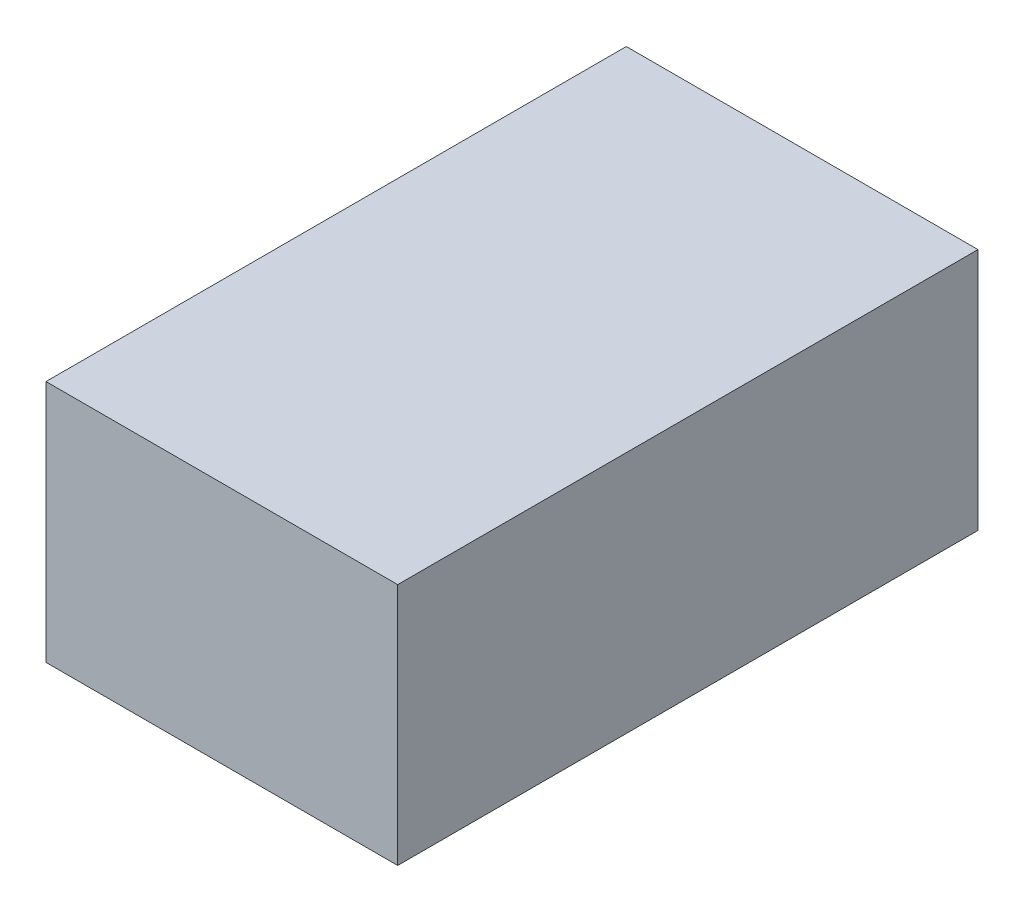
ISO-10303-21;
HEADER;
FILE_DESCRIPTION(('STEP AP214'),'2;1');
FILE_NAME('part.step','',(''),(''),'','','');
FILE_SCHEMA(('AUTOMOTIVE_DESIGN { 1 0 10303 214 1 1 1 1 }'));
ENDSEC;
DATA;
#1=APPLICATION_CONTEXT('core data for automotive mechanical design processes');
#2=APPLICATION_PROTOCOL_DEFINITION('international standard','automotive_design',2000,#1);
#3=PRODUCT_CONTEXT('',#1,'mechanical');
#4=PRODUCT('Part','Part','',(#3));
#5=PRODUCT_RELATED_PRODUCT_CATEGORY('part','',(#4));
#6=PRODUCT_DEFINITION_FORMATION('','',#4);
#7=PRODUCT_DEFINITION_CONTEXT('part definition',#1,'design');
#8=PRODUCT_DEFINITION('design','',#6,#7);
#9=PRODUCT_DEFINITION_SHAPE('','',#8);
#10=(LENGTH_UNIT() NAMED_UNIT(*) SI_UNIT(.MILLI.,.METRE.));
#11=(NAMED_UNIT(*) PLANE_ANGLE_UNIT() SI_UNIT($,.RADIAN.));
#12=(NAMED_UNIT(*) SI_UNIT($,.STERADIAN.) SOLID_ANGLE_UNIT());
#13=UNCERTAINTY_MEASURE_WITH_UNIT(LENGTH_MEASURE(1.E-05),#10,'distance_accuracy_value','');
#14=(GEOMETRIC_REPRESENTATION_CONTEXT(3) GLOBAL_UNCERTAINTY_ASSIGNED_CONTEXT((#13)) GLOBAL_UNIT_ASSIGNED_CONTEXT((#10,
#11,#12)) REPRESENTATION_CONTEXT('',''));
#15=CARTESIAN_POINT('',(0.,0.,0.));
#16=DIRECTION('',(0.,0.,1.));
#17=DIRECTION('',(1.,0.,0.));
#18=AXIS2_PLACEMENT_3D('',#15,#16,#17);
#19=CARTESIAN_POINT('',(60.,-41.5,198.));
#20=DIRECTION('',(-1.,0.,0.));
#21=DIRECTION('',(0.,0.,1.));
#22=AXIS2_PLACEMENT_3D('',#19,#20,#21);
#23=PLANE('',#22);
#24=DIRECTION('',(0.,1.,0.));
#25=VECTOR('',#24,1.);
#26=CARTESIAN_POINT('',(60.,-41.5,0.));
#27=LINE('',#26,#25);
#28=CARTESIAN_POINT('',(60.,-41.5,0.));
#29=VERTEX_POINT('',#28);
#30=CARTESIAN_POINT('',(60.,41.5,0.));
#31=VERTEX_POINT('',#30);
#32=EDGE_CURVE('E98',#29,#31,#27,.T.);
#33=ORIENTED_EDGE('',*,*,#32,.T.);
#34=DIRECTION('',(0.,0.,-1.));
#35=VECTOR('',#34,1.);
#36=CARTESIAN_POINT('',(60.,41.5,198.));
#37=LINE('',#36,#35);
#38=CARTESIAN_POINT('',(60.,41.5,198.));
#39=VERTEX_POINT('',#38);
#40=EDGE_CURVE('E11',#39,#31,#37,.T.);
#41=ORIENTED_EDGE('',*,*,#40,.F.);
#42=DIRECTION('',(0.,1.,0.));
#43=VECTOR('',#42,1.);
#44=CARTESIAN_POINT('',(60.,-41.5,198.));
#45=LINE('',#44,#43);
#46=CARTESIAN_POINT('',(60.,-41.5,198.));
#47=VERTEX_POINT('',#46);
#48=EDGE_CURVE('E86',#47,#39,#45,.T.);
#49=ORIENTED_EDGE('',*,*,#48,.F.);
#50=DIRECTION('',(0.,0.,-1.));
#51=VECTOR('',#50,1.);
#52=CARTESIAN_POINT('',(60.,-41.5,198.));
#53=LINE('',#52,#51);
#54=EDGE_CURVE('E94',#47,#29,#53,.T.);
#55=ORIENTED_EDGE('',*,*,#54,.T.);
#56=EDGE_LOOP('',(#33,#41,#49,#55));
#57=FACE_BOUND('',#56,.T.);
#58=ADVANCED_FACE('F35',(#57),#23,.F.);
#59=CARTESIAN_POINT('',(-60.,41.5,198.));
#60=DIRECTION('',(0.,-1.,0.));
#61=DIRECTION('',(0.,0.,-1.));
#62=AXIS2_PLACEMENT_3D('',#59,#60,#61);
#63=PLANE('',#62);
#64=DIRECTION('',(-1.,0.,0.));
#65=VECTOR('',#64,1.);
#66=CARTESIAN_POINT('',(-60.,41.5,0.));
#67=LINE('',#66,#65);
#68=CARTESIAN_POINT('',(-60.,41.5,0.));
#69=VERTEX_POINT('',#68);
#70=EDGE_CURVE('E90',#31,#69,#67,.T.);
#71=ORIENTED_EDGE('',*,*,#70,.T.);
#72=DIRECTION('',(0.,0.,-1.));
#73=VECTOR('',#72,1.);
#74=CARTESIAN_POINT('',(-60.,41.5,198.));
#75=LINE('',#74,#73);
#76=CARTESIAN_POINT('',(-60.,41.5,198.));
#77=VERTEX_POINT('',#76);
#78=EDGE_CURVE('E43',#77,#69,#75,.T.);
#79=ORIENTED_EDGE('',*,*,#78,.F.);
#80=DIRECTION('',(-1.,0.,0.));
#81=VECTOR('',#80,1.);
#82=CARTESIAN_POINT('',(-60.,41.5,198.));
#83=LINE('',#82,#81);
#84=EDGE_CURVE('E81',#39,#77,#83,.T.);
#85=ORIENTED_EDGE('',*,*,#84,.F.);
#86=ORIENTED_EDGE('',*,*,#40,.T.);
#87=EDGE_LOOP('',(#71,#79,#85,#86));
#88=FACE_BOUND('',#87,.T.);
#89=ADVANCED_FACE('F89',(#88),#63,.F.);
#90=CARTESIAN_POINT('',(-60.,-41.5,198.));
#91=DIRECTION('',(1.,0.,0.));
#92=DIRECTION('',(0.,1.,0.));
#93=AXIS2_PLACEMENT_3D('',#90,#91,#92);
#94=PLANE('',#93);
#95=DIRECTION('',(0.,-1.,0.));
#96=VECTOR('',#95,1.);
#97=CARTESIAN_POINT('',(-60.,-41.5,0.));
#98=LINE('',#97,#96);
#99=CARTESIAN_POINT('',(-60.,-41.5,0.));
#100=VERTEX_POINT('',#99);
#101=EDGE_CURVE('E68',#69,#100,#98,.T.);
#102=ORIENTED_EDGE('',*,*,#101,.T.);
#103=DIRECTION('',(0.,0.,-1.));
#104=VECTOR('',#103,1.);
#105=CARTESIAN_POINT('',(-60.,-41.5,198.));
#106=LINE('',#105,#104);
#107=CARTESIAN_POINT('',(-60.,-41.5,198.));
#108=VERTEX_POINT('',#107);
#109=EDGE_CURVE('E91',#108,#100,#106,.T.);
#110=ORIENTED_EDGE('',*,*,#109,.F.);
#111=DIRECTION('',(0.,-1.,0.));
#112=VECTOR('',#111,1.);
#113=CARTESIAN_POINT('',(-60.,-41.5,198.));
#114=LINE('',#113,#112);
#115=EDGE_CURVE('E84',#77,#108,#114,.T.);
#116=ORIENTED_EDGE('',*,*,#115,.F.);
#117=ORIENTED_EDGE('',*,*,#78,.T.);
#118=EDGE_LOOP('',(#102,#110,#116,#117));
#119=FACE_BOUND('',#118,.T.);
#120=ADVANCED_FACE('F92',(#119),#94,.F.);
#121=CARTESIAN_POINT('',(-60.,-41.5,198.));
#122=DIRECTION('',(0.,1.,0.));
#123=DIRECTION('',(0.,0.,1.));
#124=AXIS2_PLACEMENT_3D('',#121,#122,#123);
#125=PLANE('',#124);
#126=DIRECTION('',(1.,0.,0.));
#127=VECTOR('',#126,1.);
#128=CARTESIAN_POINT('',(-60.,-41.5,0.));
#129=LINE('',#128,#127);
#130=EDGE_CURVE('E74',#100,#29,#129,.T.);
#131=ORIENTED_EDGE('',*,*,#130,.T.);
#132=ORIENTED_EDGE('',*,*,#54,.F.);
#133=DIRECTION('',(1.,0.,0.));
#134=VECTOR('',#133,1.);
#135=CARTESIAN_POINT('',(-60.,-41.5,198.));
#136=LINE('',#135,#134);
#137=EDGE_CURVE('E51',#108,#47,#136,.T.);
#138=ORIENTED_EDGE('',*,*,#137,.F.);
#139=ORIENTED_EDGE('',*,*,#109,.T.);
#140=EDGE_LOOP('',(#131,#132,#138,#139));
#141=FACE_BOUND('',#140,.T.);
#142=ADVANCED_FACE('F105',(#141),#125,.F.);
#143=CARTESIAN_POINT('',(0.,0.,198.));
#144=DIRECTION('',(0.,0.,-1.));
#145=DIRECTION('',(-1.,0.,0.));
#146=AXIS2_PLACEMENT_3D('',#143,#144,#145);
#147=PLANE('',#146);
#148=ORIENTED_EDGE('',*,*,#48,.T.);
#149=ORIENTED_EDGE('',*,*,#84,.T.);
#150=ORIENTED_EDGE('',*,*,#115,.T.);
#151=ORIENTED_EDGE('',*,*,#137,.T.);
#152=EDGE_LOOP('',(#148,#149,#150,#151));
#153=FACE_BOUND('',#152,.T.);
#154=ADVANCED_FACE('F82',(#153),#147,.F.);
#155=CARTESIAN_POINT('',(0.,0.,0.));
#156=DIRECTION('',(0.,0.,-1.));
#157=DIRECTION('',(-1.,0.,0.));
#158=AXIS2_PLACEMENT_3D('',#155,#156,#157);
#159=PLANE('',#158);
#160=ORIENTED_EDGE('',*,*,#32,.F.);
#161=ORIENTED_EDGE('',*,*,#130,.F.);
#162=ORIENTED_EDGE('',*,*,#101,.F.);
#163=ORIENTED_EDGE('',*,*,#70,.F.);
#164=EDGE_LOOP('',(#160,#161,#162,#163));
#165=FACE_BOUND('',#164,.T.);
#166=ADVANCED_FACE('F108',(#165),#159,.T.);
#167=CLOSED_SHELL('',(#58,#89,#120,#142,#154,#166));
#168=MANIFOLD_SOLID_BREP('B2',#167);
#169=ADVANCED_BREP_SHAPE_REPRESENTATION('',(#18,#168),#14);
#170=SHAPE_DEFINITION_REPRESENTATION(#9,#169);
ENDSEC;
END-ISO-10303-21;
